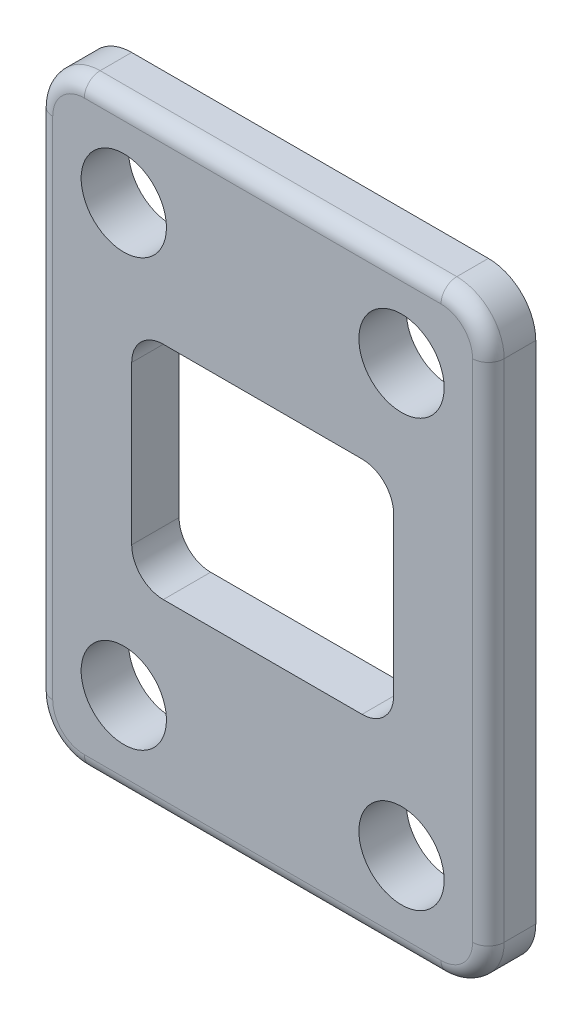
ISO-10303-21;
HEADER;
FILE_DESCRIPTION(('STEP AP214'),'2;1');
FILE_NAME('part.step','',(''),(''),'','','');
FILE_SCHEMA(('AUTOMOTIVE_DESIGN { 1 0 10303 214 1 1 1 1 }'));
ENDSEC;
DATA;
#1=APPLICATION_CONTEXT('core data for automotive mechanical design processes');
#2=APPLICATION_PROTOCOL_DEFINITION('international standard','automotive_design',2000,#1);
#3=PRODUCT_CONTEXT('',#1,'mechanical');
#4=PRODUCT('Part','Part','',(#3));
#5=PRODUCT_RELATED_PRODUCT_CATEGORY('part','',(#4));
#6=PRODUCT_DEFINITION_FORMATION('','',#4);
#7=PRODUCT_DEFINITION_CONTEXT('part definition',#1,'design');
#8=PRODUCT_DEFINITION('design','',#6,#7);
#9=PRODUCT_DEFINITION_SHAPE('','',#8);
#10=(LENGTH_UNIT() NAMED_UNIT(*) SI_UNIT(.MILLI.,.METRE.));
#11=(NAMED_UNIT(*) PLANE_ANGLE_UNIT() SI_UNIT($,.RADIAN.));
#12=(NAMED_UNIT(*) SI_UNIT($,.STERADIAN.) SOLID_ANGLE_UNIT());
#13=UNCERTAINTY_MEASURE_WITH_UNIT(LENGTH_MEASURE(1.E-05),#10,'distance_accuracy_value','');
#14=(GEOMETRIC_REPRESENTATION_CONTEXT(3) GLOBAL_UNCERTAINTY_ASSIGNED_CONTEXT((#13)) GLOBAL_UNIT_ASSIGNED_CONTEXT((#10,
#11,#12)) REPRESENTATION_CONTEXT('',''));
#15=CARTESIAN_POINT('',(0.,0.,0.));
#16=DIRECTION('',(0.,0.,1.));
#17=DIRECTION('',(1.,0.,0.));
#18=AXIS2_PLACEMENT_3D('',#15,#16,#17);
#19=CARTESIAN_POINT('',(97.5197735530745,10.0000000000001,1.5));
#20=DIRECTION('',(0.,0.,1.));
#21=DIRECTION('',(1.,0.,0.));
#22=AXIS2_PLACEMENT_3D('',#19,#20,#21);
#23=PLANE('',#22);
#24=DIRECTION('',(-1.,0.,0.));
#25=VECTOR('',#24,1.);
#26=CARTESIAN_POINT('',(86.2280338220464,11.0000000000001,1.5));
#27=LINE('',#26,#25);
#28=CARTESIAN_POINT('',(97.5197735530745,11.0000000000001,1.5));
#29=VERTEX_POINT('',#28);
#30=CARTESIAN_POINT('',(86.2280338220464,11.0000000000001,1.5));
#31=VERTEX_POINT('',#30);
#32=EDGE_CURVE('E327',#29,#31,#27,.T.);
#33=ORIENTED_EDGE('',*,*,#32,.T.);
#34=CARTESIAN_POINT('',(86.2280338220464,10.0000000000001,1.5));
#35=DIRECTION('',(0.,0.,1.));
#36=DIRECTION('',(1.,0.,0.));
#37=AXIS2_PLACEMENT_3D('',#34,#35,#36);
#38=CIRCLE('',#37,0.999999999999994);
#39=CARTESIAN_POINT('',(85.2280338220465,10.0000000000001,1.5));
#40=VERTEX_POINT('',#39);
#41=EDGE_CURVE('E329',#31,#40,#38,.T.);
#42=ORIENTED_EDGE('',*,*,#41,.T.);
#43=DIRECTION('',(0.,-1.,0.));
#44=VECTOR('',#43,1.);
#45=CARTESIAN_POINT('',(85.2280338220465,-5.99999999999995,1.5));
#46=LINE('',#45,#44);
#47=CARTESIAN_POINT('',(85.2280338220465,-5.99999999999995,1.5));
#48=VERTEX_POINT('',#47);
#49=EDGE_CURVE('E315',#40,#48,#46,.T.);
#50=ORIENTED_EDGE('',*,*,#49,.T.);
#51=CARTESIAN_POINT('',(86.2280338220464,-5.99999999999995,1.5));
#52=DIRECTION('',(0.,0.,1.));
#53=DIRECTION('',(1.,0.,0.));
#54=AXIS2_PLACEMENT_3D('',#51,#52,#53);
#55=CIRCLE('',#54,0.999999999999994);
#56=CARTESIAN_POINT('',(86.2280338220465,-6.99999999999994,1.5));
#57=VERTEX_POINT('',#56);
#58=EDGE_CURVE('E317',#48,#57,#55,.T.);
#59=ORIENTED_EDGE('',*,*,#58,.T.);
#60=DIRECTION('',(1.,0.,0.));
#61=VECTOR('',#60,1.);
#62=CARTESIAN_POINT('',(97.5197735530745,-6.99999999999993,1.5));
#63=LINE('',#62,#61);
#64=CARTESIAN_POINT('',(97.5197735530745,-6.99999999999993,1.5));
#65=VERTEX_POINT('',#64);
#66=EDGE_CURVE('E319',#57,#65,#63,.T.);
#67=ORIENTED_EDGE('',*,*,#66,.T.);
#68=CARTESIAN_POINT('',(97.5197735530745,-5.99999999999993,1.5));
#69=DIRECTION('',(0.,0.,1.));
#70=DIRECTION('',(1.,0.,0.));
#71=AXIS2_PLACEMENT_3D('',#68,#69,#70);
#72=CIRCLE('',#71,1.);
#73=CARTESIAN_POINT('',(98.5197735530745,-5.99999999999993,1.5));
#74=VERTEX_POINT('',#73);
#75=EDGE_CURVE('E321',#65,#74,#72,.T.);
#76=ORIENTED_EDGE('',*,*,#75,.T.);
#77=DIRECTION('',(0.,1.,0.));
#78=VECTOR('',#77,1.);
#79=CARTESIAN_POINT('',(98.5197735530745,10.0000000000001,1.5));
#80=LINE('',#79,#78);
#81=CARTESIAN_POINT('',(98.5197735530745,10.0000000000001,1.5));
#82=VERTEX_POINT('',#81);
#83=EDGE_CURVE('E323',#74,#82,#80,.T.);
#84=ORIENTED_EDGE('',*,*,#83,.T.);
#85=CARTESIAN_POINT('',(97.5197735530745,10.0000000000001,1.5));
#86=DIRECTION('',(0.,0.,1.));
#87=DIRECTION('',(1.,0.,0.));
#88=AXIS2_PLACEMENT_3D('',#85,#86,#87);
#89=CIRCLE('',#88,1.);
#90=EDGE_CURVE('E325',#82,#29,#89,.T.);
#91=ORIENTED_EDGE('',*,*,#90,.T.);
#92=EDGE_LOOP('',(#33,#42,#50,#59,#67,#76,#84,#91));
#93=FACE_BOUND('',#92,.T.);
#94=CARTESIAN_POINT('',(96.2697735530745,8.75000000000008,1.5));
#95=DIRECTION('',(0.,0.,1.));
#96=DIRECTION('',(1.,0.,0.));
#97=AXIS2_PLACEMENT_3D('',#94,#95,#96);
#98=CIRCLE('',#97,1.34999999999998);
#99=CARTESIAN_POINT('',(97.6197735530745,8.75000000000008,1.5));
#100=VERTEX_POINT('',#99);
#101=EDGE_CURVE('E258',#100,#100,#98,.T.);
#102=ORIENTED_EDGE('',*,*,#101,.F.);
#103=EDGE_LOOP('',(#102));
#104=FACE_BOUND('',#103,.T.);
#105=CARTESIAN_POINT('',(87.4780338220464,-4.74999999999994,1.5));
#106=DIRECTION('',(0.,0.,1.));
#107=DIRECTION('',(1.,0.,0.));
#108=AXIS2_PLACEMENT_3D('',#105,#106,#107);
#109=CIRCLE('',#108,1.35);
#110=CARTESIAN_POINT('',(88.8280338220464,-4.74999999999994,1.5));
#111=VERTEX_POINT('',#110);
#112=EDGE_CURVE('E270',#111,#111,#109,.T.);
#113=ORIENTED_EDGE('',*,*,#112,.F.);
#114=EDGE_LOOP('',(#113));
#115=FACE_BOUND('',#114,.T.);
#116=CARTESIAN_POINT('',(96.2697735530745,-4.74999999999994,1.5));
#117=DIRECTION('',(0.,0.,1.));
#118=DIRECTION('',(1.,0.,0.));
#119=AXIS2_PLACEMENT_3D('',#116,#117,#118);
#120=CIRCLE('',#119,1.35);
#121=CARTESIAN_POINT('',(97.6197735530745,-4.74999999999994,1.5));
#122=VERTEX_POINT('',#121);
#123=EDGE_CURVE('E264',#122,#122,#120,.T.);
#124=ORIENTED_EDGE('',*,*,#123,.F.);
#125=EDGE_LOOP('',(#124));
#126=FACE_BOUND('',#125,.T.);
#127=CARTESIAN_POINT('',(87.4780338220464,8.75000000000007,1.5));
#128=DIRECTION('',(0.,0.,1.));
#129=DIRECTION('',(1.,0.,0.));
#130=AXIS2_PLACEMENT_3D('',#127,#128,#129);
#131=CIRCLE('',#130,1.34999999999998);
#132=CARTESIAN_POINT('',(88.8280338220464,8.75000000000007,1.5));
#133=VERTEX_POINT('',#132);
#134=EDGE_CURVE('E252',#133,#133,#131,.T.);
#135=ORIENTED_EDGE('',*,*,#134,.F.);
#136=EDGE_LOOP('',(#135));
#137=FACE_BOUND('',#136,.T.);
#138=DIRECTION('',(0.,-1.,0.));
#139=VECTOR('',#138,1.);
#140=CARTESIAN_POINT('',(87.7280338220464,4.50000000000005,1.5));
#141=LINE('',#140,#139);
#142=CARTESIAN_POINT('',(87.7280338220464,4.50000000000005,1.5));
#143=VERTEX_POINT('',#142);
#144=CARTESIAN_POINT('',(87.7280338220464,-0.499999999999912,1.5));
#145=VERTEX_POINT('',#144);
#146=EDGE_CURVE('E192',#143,#145,#141,.T.);
#147=ORIENTED_EDGE('',*,*,#146,.F.);
#148=CARTESIAN_POINT('',(88.7280338220464,4.50000000000005,1.5));
#149=DIRECTION('',(0.,0.,1.));
#150=DIRECTION('',(1.,0.,0.));
#151=AXIS2_PLACEMENT_3D('',#148,#149,#150);
#152=CIRCLE('',#151,1.);
#153=CARTESIAN_POINT('',(88.7280338220464,5.50000000000005,1.5));
#154=VERTEX_POINT('',#153);
#155=EDGE_CURVE('E182',#154,#143,#152,.T.);
#156=ORIENTED_EDGE('',*,*,#155,.F.);
#157=DIRECTION('',(-1.,0.,0.));
#158=VECTOR('',#157,1.);
#159=CARTESIAN_POINT('',(88.7280338220464,5.50000000000005,1.5));
#160=LINE('',#159,#158);
#161=CARTESIAN_POINT('',(95.0197735530745,5.50000000000005,1.5));
#162=VERTEX_POINT('',#161);
#163=EDGE_CURVE('E218',#162,#154,#160,.T.);
#164=ORIENTED_EDGE('',*,*,#163,.F.);
#165=CARTESIAN_POINT('',(95.0197735530745,4.50000000000005,1.5));
#166=DIRECTION('',(0.,0.,1.));
#167=DIRECTION('',(-1.,0.,0.));
#168=AXIS2_PLACEMENT_3D('',#165,#166,#167);
#169=CIRCLE('',#168,1.);
#170=CARTESIAN_POINT('',(96.0197735530745,4.50000000000005,1.5));
#171=VERTEX_POINT('',#170);
#172=EDGE_CURVE('E215',#171,#162,#169,.T.);
#173=ORIENTED_EDGE('',*,*,#172,.F.);
#174=DIRECTION('',(0.,1.,0.));
#175=VECTOR('',#174,1.);
#176=CARTESIAN_POINT('',(96.0197735530745,4.50000000000005,1.5));
#177=LINE('',#176,#175);
#178=CARTESIAN_POINT('',(96.0197735530745,-0.499999999999912,1.5));
#179=VERTEX_POINT('',#178);
#180=EDGE_CURVE('E213',#179,#171,#177,.T.);
#181=ORIENTED_EDGE('',*,*,#180,.F.);
#182=CARTESIAN_POINT('',(95.0197735530745,-0.499999999999919,1.5));
#183=DIRECTION('',(0.,0.,1.));
#184=DIRECTION('',(1.,0.,0.));
#185=AXIS2_PLACEMENT_3D('',#182,#183,#184);
#186=CIRCLE('',#185,1.);
#187=CARTESIAN_POINT('',(95.0197735530745,-1.49999999999992,1.5));
#188=VERTEX_POINT('',#187);
#189=EDGE_CURVE('E211',#188,#179,#186,.T.);
#190=ORIENTED_EDGE('',*,*,#189,.F.);
#191=DIRECTION('',(1.,0.,0.));
#192=VECTOR('',#191,1.);
#193=CARTESIAN_POINT('',(88.7280338220464,-1.49999999999992,1.5));
#194=LINE('',#193,#192);
#195=CARTESIAN_POINT('',(88.7280338220464,-1.49999999999992,1.5));
#196=VERTEX_POINT('',#195);
#197=EDGE_CURVE('E207',#196,#188,#194,.T.);
#198=ORIENTED_EDGE('',*,*,#197,.F.);
#199=CARTESIAN_POINT('',(88.7280338220464,-0.499999999999919,1.5));
#200=DIRECTION('',(0.,0.,1.));
#201=DIRECTION('',(1.,0.,0.));
#202=AXIS2_PLACEMENT_3D('',#199,#200,#201);
#203=CIRCLE('',#202,1.);
#204=EDGE_CURVE('E205',#145,#196,#203,.T.);
#205=ORIENTED_EDGE('',*,*,#204,.F.);
#206=EDGE_LOOP('',(#147,#156,#164,#173,#181,#190,#198,#205));
#207=FACE_BOUND('',#206,.T.);
#208=ADVANCED_FACE('F43',(#93,#104,#115,#126,#137,#207),#23,.T.);
#209=CARTESIAN_POINT('',(97.5197735530745,10.0000000000001,0.));
#210=DIRECTION('',(0.,0.,1.));
#211=DIRECTION('',(1.,0.,0.));
#212=AXIS2_PLACEMENT_3D('',#209,#210,#211);
#213=PLANE('',#212);
#214=CARTESIAN_POINT('',(87.4780338220464,8.75000000000007,0.));
#215=DIRECTION('',(0.,0.,1.));
#216=DIRECTION('',(1.,0.,0.));
#217=AXIS2_PLACEMENT_3D('',#214,#215,#216);
#218=CIRCLE('',#217,1.34999999999998);
#219=CARTESIAN_POINT('',(88.8280338220464,8.75000000000007,0.));
#220=VERTEX_POINT('',#219);
#221=EDGE_CURVE('E200',#220,#220,#218,.T.);
#222=ORIENTED_EDGE('',*,*,#221,.T.);
#223=EDGE_LOOP('',(#222));
#224=FACE_BOUND('',#223,.T.);
#225=CARTESIAN_POINT('',(96.2697735530745,8.75000000000008,0.));
#226=DIRECTION('',(0.,0.,1.));
#227=DIRECTION('',(1.,0.,0.));
#228=AXIS2_PLACEMENT_3D('',#225,#226,#227);
#229=CIRCLE('',#228,1.34999999999998);
#230=CARTESIAN_POINT('',(97.6197735530745,8.75000000000008,0.));
#231=VERTEX_POINT('',#230);
#232=EDGE_CURVE('E255',#231,#231,#229,.T.);
#233=ORIENTED_EDGE('',*,*,#232,.T.);
#234=EDGE_LOOP('',(#233));
#235=FACE_BOUND('',#234,.T.);
#236=CARTESIAN_POINT('',(96.2697735530745,-4.74999999999994,0.));
#237=DIRECTION('',(0.,0.,1.));
#238=DIRECTION('',(1.,0.,0.));
#239=AXIS2_PLACEMENT_3D('',#236,#237,#238);
#240=CIRCLE('',#239,1.35);
#241=CARTESIAN_POINT('',(97.6197735530745,-4.74999999999994,0.));
#242=VERTEX_POINT('',#241);
#243=EDGE_CURVE('E261',#242,#242,#240,.T.);
#244=ORIENTED_EDGE('',*,*,#243,.T.);
#245=EDGE_LOOP('',(#244));
#246=FACE_BOUND('',#245,.T.);
#247=CARTESIAN_POINT('',(87.4780338220464,-4.74999999999994,0.));
#248=DIRECTION('',(0.,0.,1.));
#249=DIRECTION('',(1.,0.,0.));
#250=AXIS2_PLACEMENT_3D('',#247,#248,#249);
#251=CIRCLE('',#250,1.35);
#252=CARTESIAN_POINT('',(88.8280338220464,-4.74999999999994,0.));
#253=VERTEX_POINT('',#252);
#254=EDGE_CURVE('E267',#253,#253,#251,.T.);
#255=ORIENTED_EDGE('',*,*,#254,.T.);
#256=EDGE_LOOP('',(#255));
#257=FACE_BOUND('',#256,.T.);
#258=CARTESIAN_POINT('',(97.5197735530745,10.0000000000001,0.));
#259=DIRECTION('',(0.,0.,1.));
#260=DIRECTION('',(1.,0.,0.));
#261=AXIS2_PLACEMENT_3D('',#258,#259,#260);
#262=CIRCLE('',#261,1.5);
#263=CARTESIAN_POINT('',(99.0197735530745,10.0000000000001,0.));
#264=VERTEX_POINT('',#263);
#265=CARTESIAN_POINT('',(97.5197735530745,11.5000000000001,0.));
#266=VERTEX_POINT('',#265);
#267=EDGE_CURVE('E273',#264,#266,#262,.T.);
#268=ORIENTED_EDGE('',*,*,#267,.F.);
#269=DIRECTION('',(0.,1.,0.));
#270=VECTOR('',#269,1.);
#271=CARTESIAN_POINT('',(99.0197735530745,7.00000000000014,0.));
#272=LINE('',#271,#270);
#273=CARTESIAN_POINT('',(99.0197735530745,-5.99999999999993,0.));
#274=VERTEX_POINT('',#273);
#275=EDGE_CURVE('E296',#274,#264,#272,.T.);
#276=ORIENTED_EDGE('',*,*,#275,.F.);
#277=CARTESIAN_POINT('',(97.5197735530745,-5.99999999999993,0.));
#278=DIRECTION('',(0.,0.,1.));
#279=DIRECTION('',(1.,0.,0.));
#280=AXIS2_PLACEMENT_3D('',#277,#278,#279);
#281=CIRCLE('',#280,1.5);
#282=CARTESIAN_POINT('',(97.5197735530745,-7.49999999999993,0.));
#283=VERTEX_POINT('',#282);
#284=EDGE_CURVE('E293',#283,#274,#281,.T.);
#285=ORIENTED_EDGE('',*,*,#284,.F.);
#286=DIRECTION('',(1.,0.,0.));
#287=VECTOR('',#286,1.);
#288=CARTESIAN_POINT('',(86.2280338220465,-7.49999999999995,0.));
#289=LINE('',#288,#287);
#290=CARTESIAN_POINT('',(86.2280338220465,-7.49999999999995,0.));
#291=VERTEX_POINT('',#290);
#292=EDGE_CURVE('E290',#291,#283,#289,.T.);
#293=ORIENTED_EDGE('',*,*,#292,.F.);
#294=CARTESIAN_POINT('',(86.2280338220464,-5.99999999999995,0.));
#295=DIRECTION('',(0.,0.,1.));
#296=DIRECTION('',(1.,0.,0.));
#297=AXIS2_PLACEMENT_3D('',#294,#295,#296);
#298=CIRCLE('',#297,1.49999999999999);
#299=CARTESIAN_POINT('',(84.7280338220465,-5.99999999999995,0.));
#300=VERTEX_POINT('',#299);
#301=EDGE_CURVE('E287',#300,#291,#298,.T.);
#302=ORIENTED_EDGE('',*,*,#301,.F.);
#303=DIRECTION('',(0.,-1.,0.));
#304=VECTOR('',#303,1.);
#305=CARTESIAN_POINT('',(84.7280338220465,-2.99999999999995,0.));
#306=LINE('',#305,#304);
#307=CARTESIAN_POINT('',(84.7280338220465,10.0000000000001,0.));
#308=VERTEX_POINT('',#307);
#309=EDGE_CURVE('E284',#308,#300,#306,.T.);
#310=ORIENTED_EDGE('',*,*,#309,.F.);
#311=CARTESIAN_POINT('',(86.2280338220464,10.0000000000001,0.));
#312=DIRECTION('',(0.,0.,1.));
#313=DIRECTION('',(1.,0.,0.));
#314=AXIS2_PLACEMENT_3D('',#311,#312,#313);
#315=CIRCLE('',#314,1.49999999999999);
#316=CARTESIAN_POINT('',(86.2280338220464,11.5000000000001,0.));
#317=VERTEX_POINT('',#316);
#318=EDGE_CURVE('E281',#317,#308,#315,.T.);
#319=ORIENTED_EDGE('',*,*,#318,.F.);
#320=DIRECTION('',(-1.,0.,0.));
#321=VECTOR('',#320,1.);
#322=CARTESIAN_POINT('',(97.5197735530745,11.5000000000001,0.));
#323=LINE('',#322,#321);
#324=EDGE_CURVE('E278',#266,#317,#323,.T.);
#325=ORIENTED_EDGE('',*,*,#324,.F.);
#326=EDGE_LOOP('',(#268,#276,#285,#293,#302,#310,#319,#325));
#327=FACE_BOUND('',#326,.T.);
#328=CARTESIAN_POINT('',(88.7280338220464,4.50000000000005,0.));
#329=DIRECTION('',(0.,0.,1.));
#330=DIRECTION('',(1.,0.,0.));
#331=AXIS2_PLACEMENT_3D('',#328,#329,#330);
#332=CIRCLE('',#331,1.);
#333=CARTESIAN_POINT('',(88.7280338220464,5.50000000000005,0.));
#334=VERTEX_POINT('',#333);
#335=CARTESIAN_POINT('',(87.7280338220464,4.50000000000005,0.));
#336=VERTEX_POINT('',#335);
#337=EDGE_CURVE('E220',#334,#336,#332,.T.);
#338=ORIENTED_EDGE('',*,*,#337,.T.);
#339=DIRECTION('',(0.,-1.,0.));
#340=VECTOR('',#339,1.);
#341=CARTESIAN_POINT('',(87.7280338220464,4.50000000000005,0.));
#342=LINE('',#341,#340);
#343=CARTESIAN_POINT('',(87.7280338220464,-0.499999999999912,0.));
#344=VERTEX_POINT('',#343);
#345=EDGE_CURVE('E199',#336,#344,#342,.T.);
#346=ORIENTED_EDGE('',*,*,#345,.T.);
#347=CARTESIAN_POINT('',(88.7280338220464,-0.499999999999919,0.));
#348=DIRECTION('',(0.,0.,1.));
#349=DIRECTION('',(1.,0.,0.));
#350=AXIS2_PLACEMENT_3D('',#347,#348,#349);
#351=CIRCLE('',#350,1.);
#352=CARTESIAN_POINT('',(88.7280338220464,-1.49999999999992,0.));
#353=VERTEX_POINT('',#352);
#354=EDGE_CURVE('E223',#344,#353,#351,.T.);
#355=ORIENTED_EDGE('',*,*,#354,.T.);
#356=DIRECTION('',(1.,0.,0.));
#357=VECTOR('',#356,1.);
#358=CARTESIAN_POINT('',(88.7280338220464,-1.49999999999992,0.));
#359=LINE('',#358,#357);
#360=CARTESIAN_POINT('',(95.0197735530745,-1.49999999999992,0.));
#361=VERTEX_POINT('',#360);
#362=EDGE_CURVE('E226',#353,#361,#359,.T.);
#363=ORIENTED_EDGE('',*,*,#362,.T.);
#364=CARTESIAN_POINT('',(95.0197735530745,-0.499999999999919,0.));
#365=DIRECTION('',(0.,0.,1.));
#366=DIRECTION('',(1.,0.,0.));
#367=AXIS2_PLACEMENT_3D('',#364,#365,#366);
#368=CIRCLE('',#367,1.);
#369=CARTESIAN_POINT('',(96.0197735530745,-0.499999999999912,0.));
#370=VERTEX_POINT('',#369);
#371=EDGE_CURVE('E229',#361,#370,#368,.T.);
#372=ORIENTED_EDGE('',*,*,#371,.T.);
#373=DIRECTION('',(0.,1.,0.));
#374=VECTOR('',#373,1.);
#375=CARTESIAN_POINT('',(96.0197735530745,4.50000000000005,0.));
#376=LINE('',#375,#374);
#377=CARTESIAN_POINT('',(96.0197735530745,4.50000000000005,0.));
#378=VERTEX_POINT('',#377);
#379=EDGE_CURVE('E232',#370,#378,#376,.T.);
#380=ORIENTED_EDGE('',*,*,#379,.T.);
#381=CARTESIAN_POINT('',(95.0197735530745,4.50000000000005,0.));
#382=DIRECTION('',(0.,0.,1.));
#383=DIRECTION('',(-1.,0.,0.));
#384=AXIS2_PLACEMENT_3D('',#381,#382,#383);
#385=CIRCLE('',#384,1.);
#386=CARTESIAN_POINT('',(95.0197735530745,5.50000000000005,0.));
#387=VERTEX_POINT('',#386);
#388=EDGE_CURVE('E235',#378,#387,#385,.T.);
#389=ORIENTED_EDGE('',*,*,#388,.T.);
#390=DIRECTION('',(-1.,0.,0.));
#391=VECTOR('',#390,1.);
#392=CARTESIAN_POINT('',(88.7280338220464,5.50000000000005,0.));
#393=LINE('',#392,#391);
#394=EDGE_CURVE('E193',#387,#334,#393,.T.);
#395=ORIENTED_EDGE('',*,*,#394,.T.);
#396=EDGE_LOOP('',(#338,#346,#355,#363,#372,#380,#389,#395));
#397=FACE_BOUND('',#396,.T.);
#398=ADVANCED_FACE('F385',(#224,#235,#246,#257,#327,#397),#213,.F.);
#399=CARTESIAN_POINT('',(97.5197735530745,10.0000000000001,1.5));
#400=DIRECTION('',(0.,0.,-1.));
#401=DIRECTION('',(-1.,0.,0.));
#402=AXIS2_PLACEMENT_3D('',#399,#400,#401);
#403=CYLINDRICAL_SURFACE('',#402,1.5);
#404=DIRECTION('',(0.,0.,-1.));
#405=VECTOR('',#404,1.);
#406=CARTESIAN_POINT('',(97.5197735530745,11.5000000000001,1.5));
#407=LINE('',#406,#405);
#408=CARTESIAN_POINT('',(97.5197735530745,11.5000000000001,1.));
#409=VERTEX_POINT('',#408);
#410=EDGE_CURVE('E313',#409,#266,#407,.T.);
#411=ORIENTED_EDGE('',*,*,#410,.F.);
#412=CARTESIAN_POINT('',(97.5197735530745,10.0000000000001,1.));
#413=DIRECTION('',(0.,0.,1.));
#414=DIRECTION('',(1.,0.,0.));
#415=AXIS2_PLACEMENT_3D('',#412,#413,#414);
#416=CIRCLE('',#415,1.5);
#417=CARTESIAN_POINT('',(99.0197735530745,10.0000000000001,1.));
#418=VERTEX_POINT('',#417);
#419=EDGE_CURVE('E337',#409,#418,#416,.F.);
#420=ORIENTED_EDGE('',*,*,#419,.T.);
#421=DIRECTION('',(0.,0.,-1.));
#422=VECTOR('',#421,1.);
#423=CARTESIAN_POINT('',(99.0197735530745,10.0000000000001,1.5));
#424=LINE('',#423,#422);
#425=EDGE_CURVE('E299',#418,#264,#424,.T.);
#426=ORIENTED_EDGE('',*,*,#425,.T.);
#427=ORIENTED_EDGE('',*,*,#267,.T.);
#428=EDGE_LOOP('',(#411,#420,#426,#427));
#429=FACE_BOUND('',#428,.T.);
#430=ADVANCED_FACE('F393',(#429),#403,.T.);
#431=CARTESIAN_POINT('',(97.5197735530745,11.5000000000001,1.5));
#432=DIRECTION('',(0.,-1.,0.));
#433=DIRECTION('',(1.,0.,0.));
#434=AXIS2_PLACEMENT_3D('',#431,#432,#433);
#435=PLANE('',#434);
#436=DIRECTION('',(0.,0.,-1.));
#437=VECTOR('',#436,1.);
#438=CARTESIAN_POINT('',(86.2280338220464,11.5000000000001,1.5));
#439=LINE('',#438,#437);
#440=CARTESIAN_POINT('',(86.2280338220464,11.5000000000001,1.));
#441=VERTEX_POINT('',#440);
#442=EDGE_CURVE('E311',#441,#317,#439,.T.);
#443=ORIENTED_EDGE('',*,*,#442,.F.);
#444=DIRECTION('',(-1.,0.,0.));
#445=VECTOR('',#444,1.);
#446=CARTESIAN_POINT('',(97.5197735530745,11.5000000000001,1.));
#447=LINE('',#446,#445);
#448=EDGE_CURVE('E335',#441,#409,#447,.F.);
#449=ORIENTED_EDGE('',*,*,#448,.T.);
#450=ORIENTED_EDGE('',*,*,#410,.T.);
#451=ORIENTED_EDGE('',*,*,#324,.T.);
#452=EDGE_LOOP('',(#443,#449,#450,#451));
#453=FACE_BOUND('',#452,.T.);
#454=ADVANCED_FACE('F460',(#453),#435,.F.);
#455=CARTESIAN_POINT('',(86.2280338220464,10.0000000000001,1.5));
#456=DIRECTION('',(0.,0.,-1.));
#457=DIRECTION('',(-1.,0.,0.));
#458=AXIS2_PLACEMENT_3D('',#455,#456,#457);
#459=CYLINDRICAL_SURFACE('',#458,1.49999999999999);
#460=DIRECTION('',(0.,0.,-1.));
#461=VECTOR('',#460,1.);
#462=CARTESIAN_POINT('',(84.7280338220465,10.0000000000001,1.5));
#463=LINE('',#462,#461);
#464=CARTESIAN_POINT('',(84.7280338220465,10.0000000000001,1.));
#465=VERTEX_POINT('',#464);
#466=EDGE_CURVE('E309',#465,#308,#463,.T.);
#467=ORIENTED_EDGE('',*,*,#466,.F.);
#468=CARTESIAN_POINT('',(86.2280338220464,10.0000000000001,1.));
#469=DIRECTION('',(0.,0.,1.));
#470=DIRECTION('',(1.,0.,0.));
#471=AXIS2_PLACEMENT_3D('',#468,#469,#470);
#472=CIRCLE('',#471,1.49999999999999);
#473=EDGE_CURVE('E332',#465,#441,#472,.F.);
#474=ORIENTED_EDGE('',*,*,#473,.T.);
#475=ORIENTED_EDGE('',*,*,#442,.T.);
#476=ORIENTED_EDGE('',*,*,#318,.T.);
#477=EDGE_LOOP('',(#467,#474,#475,#476));
#478=FACE_BOUND('',#477,.T.);
#479=ADVANCED_FACE('F424',(#478),#459,.T.);
#480=CARTESIAN_POINT('',(84.7280338220465,-2.99999999999995,1.5));
#481=DIRECTION('',(1.,0.,0.));
#482=DIRECTION('',(0.,0.,-1.));
#483=AXIS2_PLACEMENT_3D('',#480,#481,#482);
#484=PLANE('',#483);
#485=DIRECTION('',(0.,0.,-1.));
#486=VECTOR('',#485,1.);
#487=CARTESIAN_POINT('',(84.7280338220465,-5.99999999999995,1.5));
#488=LINE('',#487,#486);
#489=CARTESIAN_POINT('',(84.7280338220465,-5.99999999999995,1.));
#490=VERTEX_POINT('',#489);
#491=EDGE_CURVE('E307',#490,#300,#488,.T.);
#492=ORIENTED_EDGE('',*,*,#491,.F.);
#493=DIRECTION('',(0.,-1.,0.));
#494=VECTOR('',#493,1.);
#495=CARTESIAN_POINT('',(84.7280338220465,10.0000000000001,1.));
#496=LINE('',#495,#494);
#497=EDGE_CURVE('E12',#490,#465,#496,.F.);
#498=ORIENTED_EDGE('',*,*,#497,.T.);
#499=ORIENTED_EDGE('',*,*,#466,.T.);
#500=ORIENTED_EDGE('',*,*,#309,.T.);
#501=EDGE_LOOP('',(#492,#498,#499,#500));
#502=FACE_BOUND('',#501,.T.);
#503=ADVANCED_FACE('F420',(#502),#484,.F.);
#504=CARTESIAN_POINT('',(86.2280338220464,-5.99999999999995,1.5));
#505=DIRECTION('',(0.,0.,-1.));
#506=DIRECTION('',(-1.,0.,0.));
#507=AXIS2_PLACEMENT_3D('',#504,#505,#506);
#508=CYLINDRICAL_SURFACE('',#507,1.49999999999999);
#509=DIRECTION('',(0.,0.,-1.));
#510=VECTOR('',#509,1.);
#511=CARTESIAN_POINT('',(86.2280338220465,-7.49999999999995,1.5));
#512=LINE('',#511,#510);
#513=CARTESIAN_POINT('',(86.2280338220465,-7.49999999999995,1.));
#514=VERTEX_POINT('',#513);
#515=EDGE_CURVE('E305',#514,#291,#512,.T.);
#516=ORIENTED_EDGE('',*,*,#515,.F.);
#517=CARTESIAN_POINT('',(86.2280338220464,-5.99999999999995,1.));
#518=DIRECTION('',(0.,0.,1.));
#519=DIRECTION('',(1.,0.,0.));
#520=AXIS2_PLACEMENT_3D('',#517,#518,#519);
#521=CIRCLE('',#520,1.49999999999999);
#522=EDGE_CURVE('E52',#514,#490,#521,.F.);
#523=ORIENTED_EDGE('',*,*,#522,.T.);
#524=ORIENTED_EDGE('',*,*,#491,.T.);
#525=ORIENTED_EDGE('',*,*,#301,.T.);
#526=EDGE_LOOP('',(#516,#523,#524,#525));
#527=FACE_BOUND('',#526,.T.);
#528=ADVANCED_FACE('F453',(#527),#508,.T.);
#529=CARTESIAN_POINT('',(86.2280338220465,-7.49999999999995,1.5));
#530=DIRECTION('',(0.,1.,0.));
#531=DIRECTION('',(-1.,0.,0.));
#532=AXIS2_PLACEMENT_3D('',#529,#530,#531);
#533=PLANE('',#532);
#534=DIRECTION('',(0.,0.,-1.));
#535=VECTOR('',#534,1.);
#536=CARTESIAN_POINT('',(97.5197735530745,-7.49999999999993,1.5));
#537=LINE('',#536,#535);
#538=CARTESIAN_POINT('',(97.5197735530745,-7.49999999999993,1.));
#539=VERTEX_POINT('',#538);
#540=EDGE_CURVE('E303',#539,#283,#537,.T.);
#541=ORIENTED_EDGE('',*,*,#540,.F.);
#542=DIRECTION('',(1.,0.,0.));
#543=VECTOR('',#542,1.);
#544=CARTESIAN_POINT('',(86.2280338220465,-7.49999999999995,1.));
#545=LINE('',#544,#543);
#546=EDGE_CURVE('E67',#539,#514,#545,.F.);
#547=ORIENTED_EDGE('',*,*,#546,.T.);
#548=ORIENTED_EDGE('',*,*,#515,.T.);
#549=ORIENTED_EDGE('',*,*,#292,.T.);
#550=EDGE_LOOP('',(#541,#547,#548,#549));
#551=FACE_BOUND('',#550,.T.);
#552=ADVANCED_FACE('F378',(#551),#533,.F.);
#553=CARTESIAN_POINT('',(97.5197735530745,-5.99999999999993,1.5));
#554=DIRECTION('',(0.,0.,-1.));
#555=DIRECTION('',(-1.,0.,0.));
#556=AXIS2_PLACEMENT_3D('',#553,#554,#555);
#557=CYLINDRICAL_SURFACE('',#556,1.5);
#558=DIRECTION('',(0.,0.,-1.));
#559=VECTOR('',#558,1.);
#560=CARTESIAN_POINT('',(99.0197735530745,-5.99999999999993,1.5));
#561=LINE('',#560,#559);
#562=CARTESIAN_POINT('',(99.0197735530745,-5.99999999999993,1.));
#563=VERTEX_POINT('',#562);
#564=EDGE_CURVE('E301',#563,#274,#561,.T.);
#565=ORIENTED_EDGE('',*,*,#564,.F.);
#566=CARTESIAN_POINT('',(97.5197735530745,-5.99999999999993,1.));
#567=DIRECTION('',(0.,0.,1.));
#568=DIRECTION('',(1.,0.,0.));
#569=AXIS2_PLACEMENT_3D('',#566,#567,#568);
#570=CIRCLE('',#569,1.5);
#571=EDGE_CURVE('E341',#563,#539,#570,.F.);
#572=ORIENTED_EDGE('',*,*,#571,.T.);
#573=ORIENTED_EDGE('',*,*,#540,.T.);
#574=ORIENTED_EDGE('',*,*,#284,.T.);
#575=EDGE_LOOP('',(#565,#572,#573,#574));
#576=FACE_BOUND('',#575,.T.);
#577=ADVANCED_FACE('F377',(#576),#557,.T.);
#578=CARTESIAN_POINT('',(99.0197735530745,7.00000000000014,1.5));
#579=DIRECTION('',(-1.,0.,0.));
#580=DIRECTION('',(0.,0.,1.));
#581=AXIS2_PLACEMENT_3D('',#578,#579,#580);
#582=PLANE('',#581);
#583=ORIENTED_EDGE('',*,*,#425,.F.);
#584=DIRECTION('',(0.,1.,0.));
#585=VECTOR('',#584,1.);
#586=CARTESIAN_POINT('',(99.0197735530745,-5.99999999999993,1.));
#587=LINE('',#586,#585);
#588=EDGE_CURVE('E339',#418,#563,#587,.F.);
#589=ORIENTED_EDGE('',*,*,#588,.T.);
#590=ORIENTED_EDGE('',*,*,#564,.T.);
#591=ORIENTED_EDGE('',*,*,#275,.T.);
#592=EDGE_LOOP('',(#583,#589,#590,#591));
#593=FACE_BOUND('',#592,.T.);
#594=ADVANCED_FACE('F390',(#593),#582,.F.);
#595=CARTESIAN_POINT('',(87.4780338220464,-4.74999999999994,1.5));
#596=DIRECTION('',(0.,0.,-1.));
#597=DIRECTION('',(-1.,0.,0.));
#598=AXIS2_PLACEMENT_3D('',#595,#596,#597);
#599=CYLINDRICAL_SURFACE('',#598,1.35);
#600=ORIENTED_EDGE('',*,*,#112,.T.);
#601=EDGE_LOOP('',(#600));
#602=FACE_BOUND('',#601,.T.);
#603=ORIENTED_EDGE('',*,*,#254,.F.);
#604=EDGE_LOOP('',(#603));
#605=FACE_BOUND('',#604,.T.);
#606=ADVANCED_FACE('F444',(#602,#605),#599,.F.);
#607=CARTESIAN_POINT('',(96.2697735530745,-4.74999999999994,1.5));
#608=DIRECTION('',(0.,0.,-1.));
#609=DIRECTION('',(-1.,0.,0.));
#610=AXIS2_PLACEMENT_3D('',#607,#608,#609);
#611=CYLINDRICAL_SURFACE('',#610,1.35);
#612=ORIENTED_EDGE('',*,*,#123,.T.);
#613=EDGE_LOOP('',(#612));
#614=FACE_BOUND('',#613,.T.);
#615=ORIENTED_EDGE('',*,*,#243,.F.);
#616=EDGE_LOOP('',(#615));
#617=FACE_BOUND('',#616,.T.);
#618=ADVANCED_FACE('F503',(#614,#617),#611,.F.);
#619=CARTESIAN_POINT('',(96.2697735530745,8.75000000000008,1.5));
#620=DIRECTION('',(0.,0.,-1.));
#621=DIRECTION('',(-1.,0.,0.));
#622=AXIS2_PLACEMENT_3D('',#619,#620,#621);
#623=CYLINDRICAL_SURFACE('',#622,1.34999999999998);
#624=ORIENTED_EDGE('',*,*,#101,.T.);
#625=EDGE_LOOP('',(#624));
#626=FACE_BOUND('',#625,.T.);
#627=ORIENTED_EDGE('',*,*,#232,.F.);
#628=EDGE_LOOP('',(#627));
#629=FACE_BOUND('',#628,.T.);
#630=ADVANCED_FACE('F510',(#626,#629),#623,.F.);
#631=CARTESIAN_POINT('',(87.4780338220464,8.75000000000007,1.5));
#632=DIRECTION('',(0.,0.,-1.));
#633=DIRECTION('',(-1.,0.,0.));
#634=AXIS2_PLACEMENT_3D('',#631,#632,#633);
#635=CYLINDRICAL_SURFACE('',#634,1.34999999999998);
#636=ORIENTED_EDGE('',*,*,#134,.T.);
#637=EDGE_LOOP('',(#636));
#638=FACE_BOUND('',#637,.T.);
#639=ORIENTED_EDGE('',*,*,#221,.F.);
#640=EDGE_LOOP('',(#639));
#641=FACE_BOUND('',#640,.T.);
#642=ADVANCED_FACE('F517',(#638,#641),#635,.F.);
#643=CARTESIAN_POINT('',(88.7280338220464,4.50000000000005,1.5));
#644=DIRECTION('',(0.,0.,-1.));
#645=DIRECTION('',(-1.,0.,0.));
#646=AXIS2_PLACEMENT_3D('',#643,#644,#645);
#647=CYLINDRICAL_SURFACE('',#646,1.);
#648=ORIENTED_EDGE('',*,*,#337,.F.);
#649=DIRECTION('',(0.,0.,-1.));
#650=VECTOR('',#649,1.);
#651=CARTESIAN_POINT('',(88.7280338220464,5.50000000000005,1.5));
#652=LINE('',#651,#650);
#653=EDGE_CURVE('E188',#154,#334,#652,.T.);
#654=ORIENTED_EDGE('',*,*,#653,.F.);
#655=ORIENTED_EDGE('',*,*,#155,.T.);
#656=DIRECTION('',(0.,0.,-1.));
#657=VECTOR('',#656,1.);
#658=CARTESIAN_POINT('',(87.7280338220464,4.50000000000005,1.5));
#659=LINE('',#658,#657);
#660=EDGE_CURVE('E185',#143,#336,#659,.T.);
#661=ORIENTED_EDGE('',*,*,#660,.T.);
#662=EDGE_LOOP('',(#648,#654,#655,#661));
#663=FACE_BOUND('',#662,.T.);
#664=ADVANCED_FACE('F184',(#663),#647,.F.);
#665=CARTESIAN_POINT('',(87.7280338220464,4.50000000000005,1.5));
#666=DIRECTION('',(1.,0.,0.));
#667=DIRECTION('',(0.,0.,-1.));
#668=AXIS2_PLACEMENT_3D('',#665,#666,#667);
#669=PLANE('',#668);
#670=ORIENTED_EDGE('',*,*,#345,.F.);
#671=ORIENTED_EDGE('',*,*,#660,.F.);
#672=ORIENTED_EDGE('',*,*,#146,.T.);
#673=DIRECTION('',(0.,0.,-1.));
#674=VECTOR('',#673,1.);
#675=CARTESIAN_POINT('',(87.7280338220464,-0.499999999999912,1.5));
#676=LINE('',#675,#674);
#677=EDGE_CURVE('E201',#145,#344,#676,.T.);
#678=ORIENTED_EDGE('',*,*,#677,.T.);
#679=EDGE_LOOP('',(#670,#671,#672,#678));
#680=FACE_BOUND('',#679,.T.);
#681=ADVANCED_FACE('F196',(#680),#669,.T.);
#682=CARTESIAN_POINT('',(88.7280338220464,-0.499999999999919,1.5));
#683=DIRECTION('',(0.,0.,-1.));
#684=DIRECTION('',(-1.,0.,0.));
#685=AXIS2_PLACEMENT_3D('',#682,#683,#684);
#686=CYLINDRICAL_SURFACE('',#685,1.);
#687=ORIENTED_EDGE('',*,*,#354,.F.);
#688=ORIENTED_EDGE('',*,*,#677,.F.);
#689=ORIENTED_EDGE('',*,*,#204,.T.);
#690=DIRECTION('',(0.,0.,-1.));
#691=VECTOR('',#690,1.);
#692=CARTESIAN_POINT('',(88.7280338220464,-1.49999999999992,1.5));
#693=LINE('',#692,#691);
#694=EDGE_CURVE('E249',#196,#353,#693,.T.);
#695=ORIENTED_EDGE('',*,*,#694,.T.);
#696=EDGE_LOOP('',(#687,#688,#689,#695));
#697=FACE_BOUND('',#696,.T.);
#698=ADVANCED_FACE('F538',(#697),#686,.F.);
#699=CARTESIAN_POINT('',(88.7280338220464,-1.49999999999992,1.5));
#700=DIRECTION('',(0.,1.,0.));
#701=DIRECTION('',(0.,0.,1.));
#702=AXIS2_PLACEMENT_3D('',#699,#700,#701);
#703=PLANE('',#702);
#704=ORIENTED_EDGE('',*,*,#362,.F.);
#705=ORIENTED_EDGE('',*,*,#694,.F.);
#706=ORIENTED_EDGE('',*,*,#197,.T.);
#707=DIRECTION('',(0.,0.,-1.));
#708=VECTOR('',#707,1.);
#709=CARTESIAN_POINT('',(95.0197735530745,-1.49999999999992,1.5));
#710=LINE('',#709,#708);
#711=EDGE_CURVE('E247',#188,#361,#710,.T.);
#712=ORIENTED_EDGE('',*,*,#711,.T.);
#713=EDGE_LOOP('',(#704,#705,#706,#712));
#714=FACE_BOUND('',#713,.T.);
#715=ADVANCED_FACE('F545',(#714),#703,.T.);
#716=CARTESIAN_POINT('',(95.0197735530745,-0.499999999999919,1.5));
#717=DIRECTION('',(0.,0.,-1.));
#718=DIRECTION('',(-1.,0.,0.));
#719=AXIS2_PLACEMENT_3D('',#716,#717,#718);
#720=CYLINDRICAL_SURFACE('',#719,1.);
#721=ORIENTED_EDGE('',*,*,#371,.F.);
#722=ORIENTED_EDGE('',*,*,#711,.F.);
#723=ORIENTED_EDGE('',*,*,#189,.T.);
#724=DIRECTION('',(0.,0.,-1.));
#725=VECTOR('',#724,1.);
#726=CARTESIAN_POINT('',(96.0197735530745,-0.499999999999912,1.5));
#727=LINE('',#726,#725);
#728=EDGE_CURVE('E245',#179,#370,#727,.T.);
#729=ORIENTED_EDGE('',*,*,#728,.T.);
#730=EDGE_LOOP('',(#721,#722,#723,#729));
#731=FACE_BOUND('',#730,.T.);
#732=ADVANCED_FACE('F553',(#731),#720,.F.);
#733=CARTESIAN_POINT('',(96.0197735530745,4.50000000000005,1.5));
#734=DIRECTION('',(-1.,0.,0.));
#735=DIRECTION('',(0.,0.,1.));
#736=AXIS2_PLACEMENT_3D('',#733,#734,#735);
#737=PLANE('',#736);
#738=ORIENTED_EDGE('',*,*,#379,.F.);
#739=ORIENTED_EDGE('',*,*,#728,.F.);
#740=ORIENTED_EDGE('',*,*,#180,.T.);
#741=DIRECTION('',(0.,0.,-1.));
#742=VECTOR('',#741,1.);
#743=CARTESIAN_POINT('',(96.0197735530745,4.50000000000005,1.5));
#744=LINE('',#743,#742);
#745=EDGE_CURVE('E243',#171,#378,#744,.T.);
#746=ORIENTED_EDGE('',*,*,#745,.T.);
#747=EDGE_LOOP('',(#738,#739,#740,#746));
#748=FACE_BOUND('',#747,.T.);
#749=ADVANCED_FACE('F561',(#748),#737,.T.);
#750=CARTESIAN_POINT('',(95.0197735530745,4.50000000000005,1.5));
#751=DIRECTION('',(0.,0.,-1.));
#752=DIRECTION('',(-1.,0.,0.));
#753=AXIS2_PLACEMENT_3D('',#750,#751,#752);
#754=CYLINDRICAL_SURFACE('',#753,1.);
#755=ORIENTED_EDGE('',*,*,#388,.F.);
#756=ORIENTED_EDGE('',*,*,#745,.F.);
#757=ORIENTED_EDGE('',*,*,#172,.T.);
#758=DIRECTION('',(0.,0.,-1.));
#759=VECTOR('',#758,1.);
#760=CARTESIAN_POINT('',(95.0197735530745,5.50000000000005,1.5));
#761=LINE('',#760,#759);
#762=EDGE_CURVE('E241',#162,#387,#761,.T.);
#763=ORIENTED_EDGE('',*,*,#762,.T.);
#764=EDGE_LOOP('',(#755,#756,#757,#763));
#765=FACE_BOUND('',#764,.T.);
#766=ADVANCED_FACE('F569',(#765),#754,.F.);
#767=CARTESIAN_POINT('',(88.7280338220464,5.50000000000005,1.5));
#768=DIRECTION('',(0.,-1.,0.));
#769=DIRECTION('',(0.,0.,-1.));
#770=AXIS2_PLACEMENT_3D('',#767,#768,#769);
#771=PLANE('',#770);
#772=ORIENTED_EDGE('',*,*,#394,.F.);
#773=ORIENTED_EDGE('',*,*,#762,.F.);
#774=ORIENTED_EDGE('',*,*,#163,.T.);
#775=ORIENTED_EDGE('',*,*,#653,.T.);
#776=EDGE_LOOP('',(#772,#773,#774,#775));
#777=FACE_BOUND('',#776,.T.);
#778=ADVANCED_FACE('F577',(#777),#771,.T.);
#779=CARTESIAN_POINT('',(97.5197735530745,-5.99999999999993,1.));
#780=DIRECTION('',(0.,0.,1.));
#781=DIRECTION('',(1.,0.,0.));
#782=AXIS2_PLACEMENT_3D('',#779,#780,#781);
#783=TOROIDAL_SURFACE('',#782,1.,0.5);
#784=CARTESIAN_POINT('',(97.5197735530745,-6.99999999999993,1.));
#785=DIRECTION('',(-1.,0.,0.));
#786=DIRECTION('',(0.,0.,1.));
#787=AXIS2_PLACEMENT_3D('',#784,#785,#786);
#788=CIRCLE('',#787,0.5);
#789=EDGE_CURVE('E360',#539,#65,#788,.T.);
#790=ORIENTED_EDGE('',*,*,#789,.F.);
#791=ORIENTED_EDGE('',*,*,#571,.F.);
#792=CARTESIAN_POINT('',(98.5197735530745,-5.99999999999993,1.));
#793=DIRECTION('',(0.,1.,0.));
#794=DIRECTION('',(0.,0.,1.));
#795=AXIS2_PLACEMENT_3D('',#792,#793,#794);
#796=CIRCLE('',#795,0.5);
#797=EDGE_CURVE('E47',#74,#563,#796,.T.);
#798=ORIENTED_EDGE('',*,*,#797,.F.);
#799=ORIENTED_EDGE('',*,*,#75,.F.);
#800=EDGE_LOOP('',(#790,#791,#798,#799));
#801=FACE_BOUND('',#800,.T.);
#802=ADVANCED_FACE('F45',(#801),#783,.T.);
#803=CARTESIAN_POINT('',(98.5197735530745,10.0000000000001,1.));
#804=DIRECTION('',(0.,-1.,0.));
#805=DIRECTION('',(0.,0.,-1.));
#806=AXIS2_PLACEMENT_3D('',#803,#804,#805);
#807=CYLINDRICAL_SURFACE('',#806,0.5);
#808=ORIENTED_EDGE('',*,*,#797,.T.);
#809=ORIENTED_EDGE('',*,*,#588,.F.);
#810=CARTESIAN_POINT('',(98.5197735530745,10.0000000000001,1.));
#811=DIRECTION('',(0.,1.,0.));
#812=DIRECTION('',(0.,0.,1.));
#813=AXIS2_PLACEMENT_3D('',#810,#811,#812);
#814=CIRCLE('',#813,0.5);
#815=EDGE_CURVE('E358',#82,#418,#814,.T.);
#816=ORIENTED_EDGE('',*,*,#815,.F.);
#817=ORIENTED_EDGE('',*,*,#83,.F.);
#818=EDGE_LOOP('',(#808,#809,#816,#817));
#819=FACE_BOUND('',#818,.T.);
#820=ADVANCED_FACE('F370',(#819),#807,.T.);
#821=CARTESIAN_POINT('',(97.5197735530745,-6.99999999999993,1.));
#822=DIRECTION('',(-1.,0.,0.));
#823=DIRECTION('',(0.,-1.,0.));
#824=AXIS2_PLACEMENT_3D('',#821,#822,#823);
#825=CYLINDRICAL_SURFACE('',#824,0.5);
#826=ORIENTED_EDGE('',*,*,#789,.T.);
#827=ORIENTED_EDGE('',*,*,#66,.F.);
#828=CARTESIAN_POINT('',(86.2280338220465,-6.99999999999995,1.));
#829=DIRECTION('',(-1.,0.,0.));
#830=DIRECTION('',(0.,0.,1.));
#831=AXIS2_PLACEMENT_3D('',#828,#829,#830);
#832=CIRCLE('',#831,0.5);
#833=EDGE_CURVE('E355',#514,#57,#832,.T.);
#834=ORIENTED_EDGE('',*,*,#833,.F.);
#835=ORIENTED_EDGE('',*,*,#546,.F.);
#836=EDGE_LOOP('',(#826,#827,#834,#835));
#837=FACE_BOUND('',#836,.T.);
#838=ADVANCED_FACE('F409',(#837),#825,.T.);
#839=CARTESIAN_POINT('',(97.5197735530745,10.0000000000001,1.));
#840=DIRECTION('',(0.,0.,1.));
#841=DIRECTION('',(1.,0.,0.));
#842=AXIS2_PLACEMENT_3D('',#839,#840,#841);
#843=TOROIDAL_SURFACE('',#842,1.,0.5);
#844=ORIENTED_EDGE('',*,*,#815,.T.);
#845=ORIENTED_EDGE('',*,*,#419,.F.);
#846=CARTESIAN_POINT('',(97.5197735530745,11.0000000000001,1.));
#847=DIRECTION('',(-1.,0.,0.));
#848=DIRECTION('',(0.,0.,1.));
#849=AXIS2_PLACEMENT_3D('',#846,#847,#848);
#850=CIRCLE('',#849,0.5);
#851=EDGE_CURVE('E352',#29,#409,#850,.T.);
#852=ORIENTED_EDGE('',*,*,#851,.F.);
#853=ORIENTED_EDGE('',*,*,#90,.F.);
#854=EDGE_LOOP('',(#844,#845,#852,#853));
#855=FACE_BOUND('',#854,.T.);
#856=ADVANCED_FACE('F397',(#855),#843,.T.);
#857=CARTESIAN_POINT('',(86.2280338220464,-5.99999999999995,1.));
#858=DIRECTION('',(0.,0.,1.));
#859=DIRECTION('',(1.,0.,0.));
#860=AXIS2_PLACEMENT_3D('',#857,#858,#859);
#861=TOROIDAL_SURFACE('',#860,0.999999999999994,0.5);
#862=ORIENTED_EDGE('',*,*,#833,.T.);
#863=ORIENTED_EDGE('',*,*,#58,.F.);
#864=CARTESIAN_POINT('',(85.2280338220465,-5.99999999999995,1.));
#865=DIRECTION('',(0.,1.,0.));
#866=DIRECTION('',(0.,0.,1.));
#867=AXIS2_PLACEMENT_3D('',#864,#865,#866);
#868=CIRCLE('',#867,0.5);
#869=EDGE_CURVE('E349',#490,#48,#868,.T.);
#870=ORIENTED_EDGE('',*,*,#869,.F.);
#871=ORIENTED_EDGE('',*,*,#522,.F.);
#872=EDGE_LOOP('',(#862,#863,#870,#871));
#873=FACE_BOUND('',#872,.T.);
#874=ADVANCED_FACE('F411',(#873),#861,.T.);
#875=CARTESIAN_POINT('',(97.5197735530745,11.0000000000001,1.));
#876=DIRECTION('',(1.,0.,0.));
#877=DIRECTION('',(0.,1.,0.));
#878=AXIS2_PLACEMENT_3D('',#875,#876,#877);
#879=CYLINDRICAL_SURFACE('',#878,0.5);
#880=ORIENTED_EDGE('',*,*,#851,.T.);
#881=ORIENTED_EDGE('',*,*,#448,.F.);
#882=CARTESIAN_POINT('',(86.2280338220464,11.0000000000001,1.));
#883=DIRECTION('',(-1.,0.,0.));
#884=DIRECTION('',(0.,0.,1.));
#885=AXIS2_PLACEMENT_3D('',#882,#883,#884);
#886=CIRCLE('',#885,0.5);
#887=EDGE_CURVE('E347',#31,#441,#886,.T.);
#888=ORIENTED_EDGE('',*,*,#887,.F.);
#889=ORIENTED_EDGE('',*,*,#32,.F.);
#890=EDGE_LOOP('',(#880,#881,#888,#889));
#891=FACE_BOUND('',#890,.T.);
#892=ADVANCED_FACE('F402',(#891),#879,.T.);
#893=CARTESIAN_POINT('',(85.2280338220465,10.0000000000001,1.));
#894=DIRECTION('',(0.,1.,0.));
#895=DIRECTION('',(0.,0.,1.));
#896=AXIS2_PLACEMENT_3D('',#893,#894,#895);
#897=CYLINDRICAL_SURFACE('',#896,0.5);
#898=ORIENTED_EDGE('',*,*,#869,.T.);
#899=ORIENTED_EDGE('',*,*,#49,.F.);
#900=CARTESIAN_POINT('',(85.2280338220465,10.0000000000001,1.));
#901=DIRECTION('',(0.,1.,0.));
#902=DIRECTION('',(0.,0.,1.));
#903=AXIS2_PLACEMENT_3D('',#900,#901,#902);
#904=CIRCLE('',#903,0.5);
#905=EDGE_CURVE('E345',#465,#40,#904,.T.);
#906=ORIENTED_EDGE('',*,*,#905,.F.);
#907=ORIENTED_EDGE('',*,*,#497,.F.);
#908=EDGE_LOOP('',(#898,#899,#906,#907));
#909=FACE_BOUND('',#908,.T.);
#910=ADVANCED_FACE('F417',(#909),#897,.T.);
#911=CARTESIAN_POINT('',(86.2280338220464,10.0000000000001,1.));
#912=DIRECTION('',(0.,0.,1.));
#913=DIRECTION('',(1.,0.,0.));
#914=AXIS2_PLACEMENT_3D('',#911,#912,#913);
#915=TOROIDAL_SURFACE('',#914,0.999999999999994,0.5);
#916=ORIENTED_EDGE('',*,*,#887,.T.);
#917=ORIENTED_EDGE('',*,*,#473,.F.);
#918=ORIENTED_EDGE('',*,*,#905,.T.);
#919=ORIENTED_EDGE('',*,*,#41,.F.);
#920=EDGE_LOOP('',(#916,#917,#918,#919));
#921=FACE_BOUND('',#920,.T.);
#922=ADVANCED_FACE('F428',(#921),#915,.T.);
#923=CLOSED_SHELL('',(#208,#398,#430,#454,#479,#503,#528,#552,#577,#594,#606,#618,#630,#642,
#664,#681,#698,#715,#732,#749,#766,#778,#802,#820,#838,#856,#874,#892,#910,#922));
#924=MANIFOLD_SOLID_BREP('B2',#923);
#925=ADVANCED_BREP_SHAPE_REPRESENTATION('',(#18,#924),#14);
#926=SHAPE_DEFINITION_REPRESENTATION(#9,#925);
ENDSEC;
END-ISO-10303-21;
